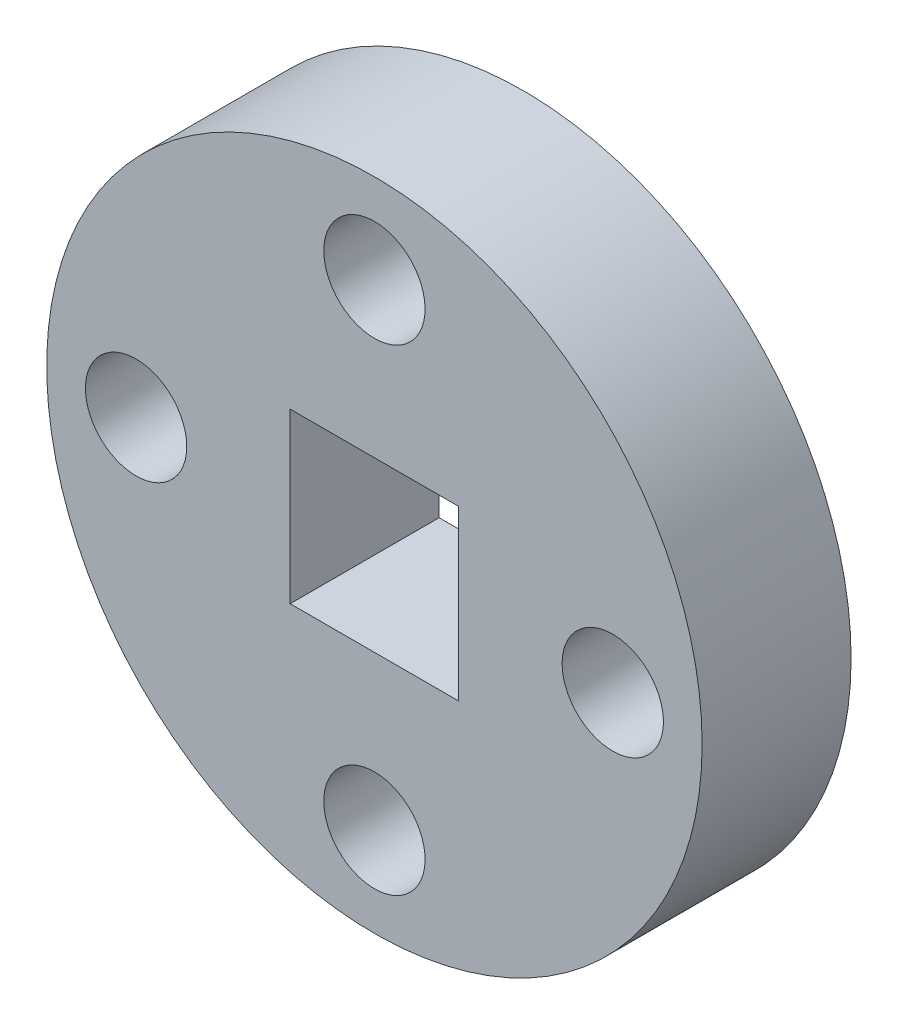
ISO-10303-21;
HEADER;
FILE_DESCRIPTION(('STEP AP214'),'2;1');
FILE_NAME('part.step','',(''),(''),'','','');
FILE_SCHEMA(('AUTOMOTIVE_DESIGN { 1 0 10303 214 1 1 1 1 }'));
ENDSEC;
DATA;
#1=APPLICATION_CONTEXT('core data for automotive mechanical design processes');
#2=APPLICATION_PROTOCOL_DEFINITION('international standard','automotive_design',2000,#1);
#3=PRODUCT_CONTEXT('',#1,'mechanical');
#4=PRODUCT('Part','Part','',(#3));
#5=PRODUCT_RELATED_PRODUCT_CATEGORY('part','',(#4));
#6=PRODUCT_DEFINITION_FORMATION('','',#4);
#7=PRODUCT_DEFINITION_CONTEXT('part definition',#1,'design');
#8=PRODUCT_DEFINITION('design','',#6,#7);
#9=PRODUCT_DEFINITION_SHAPE('','',#8);
#10=(LENGTH_UNIT() NAMED_UNIT(*) SI_UNIT(.MILLI.,.METRE.));
#11=(NAMED_UNIT(*) PLANE_ANGLE_UNIT() SI_UNIT($,.RADIAN.));
#12=(NAMED_UNIT(*) SI_UNIT($,.STERADIAN.) SOLID_ANGLE_UNIT());
#13=UNCERTAINTY_MEASURE_WITH_UNIT(LENGTH_MEASURE(1.E-05),#10,'distance_accuracy_value','');
#14=(GEOMETRIC_REPRESENTATION_CONTEXT(3) GLOBAL_UNCERTAINTY_ASSIGNED_CONTEXT((#13)) GLOBAL_UNIT_ASSIGNED_CONTEXT((#10,
#11,#12)) REPRESENTATION_CONTEXT('',''));
#15=CARTESIAN_POINT('',(0.,0.,0.));
#16=DIRECTION('',(0.,0.,1.));
#17=DIRECTION('',(1.,0.,0.));
#18=AXIS2_PLACEMENT_3D('',#15,#16,#17);
#19=CARTESIAN_POINT('',(8.,0.,5.));
#20=DIRECTION('',(0.,0.,1.));
#21=DIRECTION('',(1.,0.,0.));
#22=AXIS2_PLACEMENT_3D('',#19,#20,#21);
#23=CYLINDRICAL_SURFACE('',#22,0.999999999999999);
#24=CARTESIAN_POINT('',(8.,0.,0.));
#25=DIRECTION('',(0.,0.,1.));
#26=DIRECTION('',(1.,0.,0.));
#27=AXIS2_PLACEMENT_3D('',#24,#25,#26);
#28=CIRCLE('',#27,0.999999999999999);
#29=CARTESIAN_POINT('',(9.,0.,0.));
#30=VERTEX_POINT('',#29);
#31=EDGE_CURVE('E116',#30,#30,#28,.T.);
#32=ORIENTED_EDGE('',*,*,#31,.F.);
#33=EDGE_LOOP('',(#32));
#34=FACE_BOUND('',#33,.T.);
#35=CARTESIAN_POINT('',(8.,0.,2.5));
#36=DIRECTION('',(0.,0.,1.));
#37=DIRECTION('',(1.,0.,0.));
#38=AXIS2_PLACEMENT_3D('',#35,#36,#37);
#39=CIRCLE('',#38,0.999999999999999);
#40=CARTESIAN_POINT('',(9.,0.,2.5));
#41=VERTEX_POINT('',#40);
#42=EDGE_CURVE('E49',#41,#41,#39,.F.);
#43=ORIENTED_EDGE('',*,*,#42,.F.);
#44=EDGE_LOOP('',(#43));
#45=FACE_BOUND('',#44,.T.);
#46=ADVANCED_FACE('F45',(#34,#45),#23,.F.);
#47=CARTESIAN_POINT('',(0.,-8.,5.));
#48=DIRECTION('',(0.,0.,1.));
#49=DIRECTION('',(1.,0.,0.));
#50=AXIS2_PLACEMENT_3D('',#47,#48,#49);
#51=CYLINDRICAL_SURFACE('',#50,0.999999999999999);
#52=CARTESIAN_POINT('',(0.,-8.,0.));
#53=DIRECTION('',(0.,0.,1.));
#54=DIRECTION('',(1.,0.,0.));
#55=AXIS2_PLACEMENT_3D('',#52,#53,#54);
#56=CIRCLE('',#55,0.999999999999999);
#57=CARTESIAN_POINT('',(0.999999999999999,-8.,0.));
#58=VERTEX_POINT('',#57);
#59=EDGE_CURVE('E157',#58,#58,#56,.T.);
#60=ORIENTED_EDGE('',*,*,#59,.F.);
#61=EDGE_LOOP('',(#60));
#62=FACE_BOUND('',#61,.T.);
#63=CARTESIAN_POINT('',(0.,-8.,2.5));
#64=DIRECTION('',(0.,0.,1.));
#65=DIRECTION('',(1.,0.,0.));
#66=AXIS2_PLACEMENT_3D('',#63,#64,#65);
#67=CIRCLE('',#66,0.999999999999999);
#68=CARTESIAN_POINT('',(0.999999999999999,-8.,2.5));
#69=VERTEX_POINT('',#68);
#70=EDGE_CURVE('E135',#69,#69,#67,.F.);
#71=ORIENTED_EDGE('',*,*,#70,.F.);
#72=EDGE_LOOP('',(#71));
#73=FACE_BOUND('',#72,.T.);
#74=ADVANCED_FACE('F167',(#62,#73),#51,.F.);
#75=CARTESIAN_POINT('',(0.,8.,5.));
#76=DIRECTION('',(0.,0.,1.));
#77=DIRECTION('',(1.,0.,0.));
#78=AXIS2_PLACEMENT_3D('',#75,#76,#77);
#79=CYLINDRICAL_SURFACE('',#78,0.999999999999999);
#80=CARTESIAN_POINT('',(0.,8.,0.));
#81=DIRECTION('',(0.,0.,1.));
#82=DIRECTION('',(1.,0.,0.));
#83=AXIS2_PLACEMENT_3D('',#80,#81,#82);
#84=CIRCLE('',#83,0.999999999999999);
#85=CARTESIAN_POINT('',(0.999999999999999,8.,0.));
#86=VERTEX_POINT('',#85);
#87=EDGE_CURVE('E131',#86,#86,#84,.T.);
#88=ORIENTED_EDGE('',*,*,#87,.F.);
#89=EDGE_LOOP('',(#88));
#90=FACE_BOUND('',#89,.T.);
#91=CARTESIAN_POINT('',(0.,8.,2.5));
#92=DIRECTION('',(0.,0.,1.));
#93=DIRECTION('',(1.,0.,0.));
#94=AXIS2_PLACEMENT_3D('',#91,#92,#93);
#95=CIRCLE('',#94,0.999999999999999);
#96=CARTESIAN_POINT('',(0.999999999999999,8.,2.5));
#97=VERTEX_POINT('',#96);
#98=EDGE_CURVE('E133',#97,#97,#95,.F.);
#99=ORIENTED_EDGE('',*,*,#98,.F.);
#100=EDGE_LOOP('',(#99));
#101=FACE_BOUND('',#100,.T.);
#102=ADVANCED_FACE('F173',(#90,#101),#79,.F.);
#103=CARTESIAN_POINT('',(-8.,0.,5.));
#104=DIRECTION('',(0.,0.,1.));
#105=DIRECTION('',(1.,0.,0.));
#106=AXIS2_PLACEMENT_3D('',#103,#104,#105);
#107=CYLINDRICAL_SURFACE('',#106,0.999999999999999);
#108=CARTESIAN_POINT('',(-8.,0.,0.));
#109=DIRECTION('',(0.,0.,1.));
#110=DIRECTION('',(1.,0.,0.));
#111=AXIS2_PLACEMENT_3D('',#108,#109,#110);
#112=CIRCLE('',#111,0.999999999999999);
#113=CARTESIAN_POINT('',(-7.,0.,0.));
#114=VERTEX_POINT('',#113);
#115=EDGE_CURVE('E154',#114,#114,#112,.T.);
#116=ORIENTED_EDGE('',*,*,#115,.F.);
#117=EDGE_LOOP('',(#116));
#118=FACE_BOUND('',#117,.T.);
#119=CARTESIAN_POINT('',(-8.,0.,2.5));
#120=DIRECTION('',(0.,0.,1.));
#121=DIRECTION('',(1.,0.,0.));
#122=AXIS2_PLACEMENT_3D('',#119,#120,#121);
#123=CIRCLE('',#122,0.999999999999999);
#124=CARTESIAN_POINT('',(-7.,0.,2.5));
#125=VERTEX_POINT('',#124);
#126=EDGE_CURVE('E128',#125,#125,#123,.F.);
#127=ORIENTED_EDGE('',*,*,#126,.F.);
#128=EDGE_LOOP('',(#127));
#129=FACE_BOUND('',#128,.T.);
#130=ADVANCED_FACE('F191',(#118,#129),#107,.F.);
#131=CARTESIAN_POINT('',(0.,0.,5.));
#132=DIRECTION('',(0.,0.,1.));
#133=DIRECTION('',(1.,0.,0.));
#134=AXIS2_PLACEMENT_3D('',#131,#132,#133);
#135=PLANE('',#134);
#136=CARTESIAN_POINT('',(0.,-8.,5.));
#137=DIRECTION('',(0.,0.,1.));
#138=DIRECTION('',(0.,1.,0.));
#139=AXIS2_PLACEMENT_3D('',#136,#137,#138);
#140=CIRCLE('',#139,1.7);
#141=CARTESIAN_POINT('',(0.,-6.3,5.));
#142=VERTEX_POINT('',#141);
#143=EDGE_CURVE('E257',#142,#142,#140,.T.);
#144=ORIENTED_EDGE('',*,*,#143,.F.);
#145=EDGE_LOOP('',(#144));
#146=FACE_BOUND('',#145,.T.);
#147=CARTESIAN_POINT('',(8.,0.,5.));
#148=DIRECTION('',(0.,0.,1.));
#149=DIRECTION('',(-1.,0.,0.));
#150=AXIS2_PLACEMENT_3D('',#147,#148,#149);
#151=CIRCLE('',#150,1.7);
#152=CARTESIAN_POINT('',(6.3,0.,5.));
#153=VERTEX_POINT('',#152);
#154=EDGE_CURVE('E265',#153,#153,#151,.T.);
#155=ORIENTED_EDGE('',*,*,#154,.F.);
#156=EDGE_LOOP('',(#155));
#157=FACE_BOUND('',#156,.T.);
#158=CARTESIAN_POINT('',(0.,8.,5.));
#159=DIRECTION('',(0.,0.,1.));
#160=DIRECTION('',(0.,-1.,0.));
#161=AXIS2_PLACEMENT_3D('',#158,#159,#160);
#162=CIRCLE('',#161,1.7);
#163=CARTESIAN_POINT('',(0.,6.3,5.));
#164=VERTEX_POINT('',#163);
#165=EDGE_CURVE('E269',#164,#164,#162,.T.);
#166=ORIENTED_EDGE('',*,*,#165,.F.);
#167=EDGE_LOOP('',(#166));
#168=FACE_BOUND('',#167,.T.);
#169=CARTESIAN_POINT('',(-8.,0.,5.));
#170=DIRECTION('',(0.,0.,1.));
#171=DIRECTION('',(1.,0.,0.));
#172=AXIS2_PLACEMENT_3D('',#169,#170,#171);
#173=CIRCLE('',#172,1.7);
#174=CARTESIAN_POINT('',(-6.3,0.,5.));
#175=VERTEX_POINT('',#174);
#176=EDGE_CURVE('E141',#175,#175,#173,.T.);
#177=ORIENTED_EDGE('',*,*,#176,.F.);
#178=EDGE_LOOP('',(#177));
#179=FACE_BOUND('',#178,.T.);
#180=CARTESIAN_POINT('',(0.,0.,5.));
#181=DIRECTION('',(0.,0.,1.));
#182=DIRECTION('',(1.,0.,0.));
#183=AXIS2_PLACEMENT_3D('',#180,#181,#182);
#184=CIRCLE('',#183,11.);
#185=CARTESIAN_POINT('',(11.,0.,5.));
#186=VERTEX_POINT('',#185);
#187=EDGE_CURVE('E11',#186,#186,#184,.T.);
#188=ORIENTED_EDGE('',*,*,#187,.T.);
#189=EDGE_LOOP('',(#188));
#190=FACE_BOUND('',#189,.T.);
#191=DIRECTION('',(0.,1.,0.));
#192=VECTOR('',#191,1.);
#193=CARTESIAN_POINT('',(2.82842712474619,-2.82842712474619,5.));
#194=LINE('',#193,#192);
#195=CARTESIAN_POINT('',(2.82842712474619,-2.82842712474619,5.));
#196=VERTEX_POINT('',#195);
#197=CARTESIAN_POINT('',(2.82842712474619,2.82842712474619,5.));
#198=VERTEX_POINT('',#197);
#199=EDGE_CURVE('E96',#196,#198,#194,.T.);
#200=ORIENTED_EDGE('',*,*,#199,.F.);
#201=DIRECTION('',(1.,0.,0.));
#202=VECTOR('',#201,1.);
#203=CARTESIAN_POINT('',(-2.82842712474619,-2.82842712474619,5.));
#204=LINE('',#203,#202);
#205=CARTESIAN_POINT('',(-2.82842712474619,-2.82842712474619,5.));
#206=VERTEX_POINT('',#205);
#207=EDGE_CURVE('E88',#206,#196,#204,.T.);
#208=ORIENTED_EDGE('',*,*,#207,.F.);
#209=DIRECTION('',(0.,-1.,0.));
#210=VECTOR('',#209,1.);
#211=CARTESIAN_POINT('',(-2.82842712474619,-2.82842712474619,5.));
#212=LINE('',#211,#210);
#213=CARTESIAN_POINT('',(-2.82842712474619,2.82842712474619,5.));
#214=VERTEX_POINT('',#213);
#215=EDGE_CURVE('E110',#214,#206,#212,.T.);
#216=ORIENTED_EDGE('',*,*,#215,.F.);
#217=DIRECTION('',(-1.,0.,0.));
#218=VECTOR('',#217,1.);
#219=CARTESIAN_POINT('',(-2.82842712474619,2.82842712474619,5.));
#220=LINE('',#219,#218);
#221=EDGE_CURVE('E108',#198,#214,#220,.T.);
#222=ORIENTED_EDGE('',*,*,#221,.F.);
#223=EDGE_LOOP('',(#200,#208,#216,#222));
#224=FACE_BOUND('',#223,.T.);
#225=ADVANCED_FACE('F107',(#146,#157,#168,#179,#190,#224),#135,.T.);
#226=CARTESIAN_POINT('',(0.,0.,0.));
#227=DIRECTION('',(0.,0.,1.));
#228=DIRECTION('',(1.,0.,0.));
#229=AXIS2_PLACEMENT_3D('',#226,#227,#228);
#230=PLANE('',#229);
#231=ORIENTED_EDGE('',*,*,#87,.T.);
#232=EDGE_LOOP('',(#231));
#233=FACE_BOUND('',#232,.T.);
#234=ORIENTED_EDGE('',*,*,#115,.T.);
#235=EDGE_LOOP('',(#234));
#236=FACE_BOUND('',#235,.T.);
#237=ORIENTED_EDGE('',*,*,#59,.T.);
#238=EDGE_LOOP('',(#237));
#239=FACE_BOUND('',#238,.T.);
#240=ORIENTED_EDGE('',*,*,#31,.T.);
#241=EDGE_LOOP('',(#240));
#242=FACE_BOUND('',#241,.T.);
#243=CARTESIAN_POINT('',(0.,0.,0.));
#244=DIRECTION('',(0.,0.,1.));
#245=DIRECTION('',(1.,0.,0.));
#246=AXIS2_PLACEMENT_3D('',#243,#244,#245);
#247=CIRCLE('',#246,11.);
#248=CARTESIAN_POINT('',(11.,0.,0.));
#249=VERTEX_POINT('',#248);
#250=EDGE_CURVE('E54',#249,#249,#247,.T.);
#251=ORIENTED_EDGE('',*,*,#250,.F.);
#252=EDGE_LOOP('',(#251));
#253=FACE_BOUND('',#252,.T.);
#254=DIRECTION('',(1.,0.,0.));
#255=VECTOR('',#254,1.);
#256=CARTESIAN_POINT('',(-2.82842712474619,-2.82842712474619,0.));
#257=LINE('',#256,#255);
#258=CARTESIAN_POINT('',(-2.82842712474619,-2.82842712474619,0.));
#259=VERTEX_POINT('',#258);
#260=CARTESIAN_POINT('',(2.82842712474619,-2.82842712474619,0.));
#261=VERTEX_POINT('',#260);
#262=EDGE_CURVE('E70',#259,#261,#257,.T.);
#263=ORIENTED_EDGE('',*,*,#262,.T.);
#264=DIRECTION('',(0.,1.,0.));
#265=VECTOR('',#264,1.);
#266=CARTESIAN_POINT('',(2.82842712474619,-2.82842712474619,0.));
#267=LINE('',#266,#265);
#268=CARTESIAN_POINT('',(2.82842712474619,2.82842712474619,0.));
#269=VERTEX_POINT('',#268);
#270=EDGE_CURVE('E103',#261,#269,#267,.T.);
#271=ORIENTED_EDGE('',*,*,#270,.T.);
#272=DIRECTION('',(-1.,0.,0.));
#273=VECTOR('',#272,1.);
#274=CARTESIAN_POINT('',(-2.82842712474619,2.82842712474619,0.));
#275=LINE('',#274,#273);
#276=CARTESIAN_POINT('',(-2.82842712474619,2.82842712474619,0.));
#277=VERTEX_POINT('',#276);
#278=EDGE_CURVE('E118',#269,#277,#275,.T.);
#279=ORIENTED_EDGE('',*,*,#278,.T.);
#280=DIRECTION('',(0.,-1.,0.));
#281=VECTOR('',#280,1.);
#282=CARTESIAN_POINT('',(-2.82842712474619,-2.82842712474619,0.));
#283=LINE('',#282,#281);
#284=EDGE_CURVE('E97',#277,#259,#283,.T.);
#285=ORIENTED_EDGE('',*,*,#284,.T.);
#286=EDGE_LOOP('',(#263,#271,#279,#285));
#287=FACE_BOUND('',#286,.T.);
#288=ADVANCED_FACE('F162',(#233,#236,#239,#242,#253,#287),#230,.F.);
#289=CARTESIAN_POINT('',(0.,0.,5.));
#290=DIRECTION('',(0.,0.,-1.));
#291=DIRECTION('',(-1.,0.,0.));
#292=AXIS2_PLACEMENT_3D('',#289,#290,#291);
#293=CYLINDRICAL_SURFACE('',#292,11.);
#294=ORIENTED_EDGE('',*,*,#187,.F.);
#295=EDGE_LOOP('',(#294));
#296=FACE_BOUND('',#295,.T.);
#297=ORIENTED_EDGE('',*,*,#250,.T.);
#298=EDGE_LOOP('',(#297));
#299=FACE_BOUND('',#298,.T.);
#300=ADVANCED_FACE('F47',(#296,#299),#293,.T.);
#301=CARTESIAN_POINT('',(-2.82842712474619,-2.82842712474619,5.));
#302=DIRECTION('',(0.,1.,0.));
#303=DIRECTION('',(0.,0.,1.));
#304=AXIS2_PLACEMENT_3D('',#301,#302,#303);
#305=PLANE('',#304);
#306=ORIENTED_EDGE('',*,*,#262,.F.);
#307=DIRECTION('',(0.,0.,-1.));
#308=VECTOR('',#307,1.);
#309=CARTESIAN_POINT('',(-2.82842712474619,-2.82842712474619,5.));
#310=LINE('',#309,#308);
#311=EDGE_CURVE('E92',#206,#259,#310,.T.);
#312=ORIENTED_EDGE('',*,*,#311,.F.);
#313=ORIENTED_EDGE('',*,*,#207,.T.);
#314=DIRECTION('',(0.,0.,-1.));
#315=VECTOR('',#314,1.);
#316=CARTESIAN_POINT('',(2.82842712474619,-2.82842712474619,5.));
#317=LINE('',#316,#315);
#318=EDGE_CURVE('E91',#196,#261,#317,.T.);
#319=ORIENTED_EDGE('',*,*,#318,.T.);
#320=EDGE_LOOP('',(#306,#312,#313,#319));
#321=FACE_BOUND('',#320,.T.);
#322=ADVANCED_FACE('F90',(#321),#305,.T.);
#323=CARTESIAN_POINT('',(2.82842712474619,-2.82842712474619,5.));
#324=DIRECTION('',(-1.,0.,0.));
#325=DIRECTION('',(0.,0.,1.));
#326=AXIS2_PLACEMENT_3D('',#323,#324,#325);
#327=PLANE('',#326);
#328=ORIENTED_EDGE('',*,*,#270,.F.);
#329=ORIENTED_EDGE('',*,*,#318,.F.);
#330=ORIENTED_EDGE('',*,*,#199,.T.);
#331=DIRECTION('',(0.,0.,-1.));
#332=VECTOR('',#331,1.);
#333=CARTESIAN_POINT('',(2.82842712474619,2.82842712474619,5.));
#334=LINE('',#333,#332);
#335=EDGE_CURVE('E104',#198,#269,#334,.T.);
#336=ORIENTED_EDGE('',*,*,#335,.T.);
#337=EDGE_LOOP('',(#328,#329,#330,#336));
#338=FACE_BOUND('',#337,.T.);
#339=ADVANCED_FACE('F100',(#338),#327,.T.);
#340=CARTESIAN_POINT('',(-2.82842712474619,2.82842712474619,5.));
#341=DIRECTION('',(0.,-1.,0.));
#342=DIRECTION('',(0.,0.,-1.));
#343=AXIS2_PLACEMENT_3D('',#340,#341,#342);
#344=PLANE('',#343);
#345=ORIENTED_EDGE('',*,*,#278,.F.);
#346=ORIENTED_EDGE('',*,*,#335,.F.);
#347=ORIENTED_EDGE('',*,*,#221,.T.);
#348=DIRECTION('',(0.,0.,-1.));
#349=VECTOR('',#348,1.);
#350=CARTESIAN_POINT('',(-2.82842712474619,2.82842712474619,5.));
#351=LINE('',#350,#349);
#352=EDGE_CURVE('E62',#214,#277,#351,.T.);
#353=ORIENTED_EDGE('',*,*,#352,.T.);
#354=EDGE_LOOP('',(#345,#346,#347,#353));
#355=FACE_BOUND('',#354,.T.);
#356=ADVANCED_FACE('F182',(#355),#344,.T.);
#357=CARTESIAN_POINT('',(-2.82842712474619,-2.82842712474619,5.));
#358=DIRECTION('',(1.,0.,0.));
#359=DIRECTION('',(0.,0.,-1.));
#360=AXIS2_PLACEMENT_3D('',#357,#358,#359);
#361=PLANE('',#360);
#362=ORIENTED_EDGE('',*,*,#284,.F.);
#363=ORIENTED_EDGE('',*,*,#352,.F.);
#364=ORIENTED_EDGE('',*,*,#215,.T.);
#365=ORIENTED_EDGE('',*,*,#311,.T.);
#366=EDGE_LOOP('',(#362,#363,#364,#365));
#367=FACE_BOUND('',#366,.T.);
#368=ADVANCED_FACE('F178',(#367),#361,.T.);
#369=CARTESIAN_POINT('',(-8.,0.,2.5));
#370=DIRECTION('',(0.,0.,1.));
#371=DIRECTION('',(1.,0.,0.));
#372=AXIS2_PLACEMENT_3D('',#369,#370,#371);
#373=PLANE('',#372);
#374=CARTESIAN_POINT('',(-8.,0.,2.5));
#375=DIRECTION('',(0.,0.,1.));
#376=DIRECTION('',(1.,0.,0.));
#377=AXIS2_PLACEMENT_3D('',#374,#375,#376);
#378=CIRCLE('',#377,1.7);
#379=CARTESIAN_POINT('',(-6.3,0.,2.5));
#380=VERTEX_POINT('',#379);
#381=EDGE_CURVE('E132',#380,#380,#378,.T.);
#382=ORIENTED_EDGE('',*,*,#381,.T.);
#383=EDGE_LOOP('',(#382));
#384=FACE_BOUND('',#383,.T.);
#385=ORIENTED_EDGE('',*,*,#126,.T.);
#386=EDGE_LOOP('',(#385));
#387=FACE_BOUND('',#386,.T.);
#388=ADVANCED_FACE('F181',(#384,#387),#373,.T.);
#389=CARTESIAN_POINT('',(-8.,0.,2.5));
#390=DIRECTION('',(0.,0.,1.));
#391=DIRECTION('',(1.,0.,0.));
#392=AXIS2_PLACEMENT_3D('',#389,#390,#391);
#393=CYLINDRICAL_SURFACE('',#392,1.7);
#394=ORIENTED_EDGE('',*,*,#381,.F.);
#395=EDGE_LOOP('',(#394));
#396=FACE_BOUND('',#395,.T.);
#397=ORIENTED_EDGE('',*,*,#176,.T.);
#398=EDGE_LOOP('',(#397));
#399=FACE_BOUND('',#398,.T.);
#400=ADVANCED_FACE('F211',(#396,#399),#393,.F.);
#401=CARTESIAN_POINT('',(0.,8.,2.5));
#402=DIRECTION('',(0.,0.,1.));
#403=DIRECTION('',(0.,-1.,0.));
#404=AXIS2_PLACEMENT_3D('',#401,#402,#403);
#405=PLANE('',#404);
#406=CARTESIAN_POINT('',(0.,8.,2.5));
#407=DIRECTION('',(0.,0.,1.));
#408=DIRECTION('',(0.,-1.,0.));
#409=AXIS2_PLACEMENT_3D('',#406,#407,#408);
#410=CIRCLE('',#409,1.7);
#411=CARTESIAN_POINT('',(0.,6.3,2.5));
#412=VERTEX_POINT('',#411);
#413=EDGE_CURVE('E268',#412,#412,#410,.T.);
#414=ORIENTED_EDGE('',*,*,#413,.T.);
#415=EDGE_LOOP('',(#414));
#416=FACE_BOUND('',#415,.T.);
#417=ORIENTED_EDGE('',*,*,#98,.T.);
#418=EDGE_LOOP('',(#417));
#419=FACE_BOUND('',#418,.T.);
#420=ADVANCED_FACE('F216',(#416,#419),#405,.T.);
#421=CARTESIAN_POINT('',(0.,8.,2.5));
#422=DIRECTION('',(0.,0.,1.));
#423=DIRECTION('',(1.,0.,0.));
#424=AXIS2_PLACEMENT_3D('',#421,#422,#423);
#425=CYLINDRICAL_SURFACE('',#424,1.7);
#426=ORIENTED_EDGE('',*,*,#413,.F.);
#427=EDGE_LOOP('',(#426));
#428=FACE_BOUND('',#427,.T.);
#429=ORIENTED_EDGE('',*,*,#165,.T.);
#430=EDGE_LOOP('',(#429));
#431=FACE_BOUND('',#430,.T.);
#432=ADVANCED_FACE('F220',(#428,#431),#425,.F.);
#433=CARTESIAN_POINT('',(0.,-8.,2.5));
#434=DIRECTION('',(0.,0.,1.));
#435=DIRECTION('',(0.,1.,0.));
#436=AXIS2_PLACEMENT_3D('',#433,#434,#435);
#437=PLANE('',#436);
#438=CARTESIAN_POINT('',(0.,-8.,2.5));
#439=DIRECTION('',(0.,0.,1.));
#440=DIRECTION('',(0.,1.,0.));
#441=AXIS2_PLACEMENT_3D('',#438,#439,#440);
#442=CIRCLE('',#441,1.7);
#443=CARTESIAN_POINT('',(0.,-6.3,2.5));
#444=VERTEX_POINT('',#443);
#445=EDGE_CURVE('E136',#444,#444,#442,.T.);
#446=ORIENTED_EDGE('',*,*,#445,.T.);
#447=EDGE_LOOP('',(#446));
#448=FACE_BOUND('',#447,.T.);
#449=ORIENTED_EDGE('',*,*,#70,.T.);
#450=EDGE_LOOP('',(#449));
#451=FACE_BOUND('',#450,.T.);
#452=ADVANCED_FACE('F235',(#448,#451),#437,.T.);
#453=CARTESIAN_POINT('',(0.,-8.,2.5));
#454=DIRECTION('',(0.,0.,1.));
#455=DIRECTION('',(1.,0.,0.));
#456=AXIS2_PLACEMENT_3D('',#453,#454,#455);
#457=CYLINDRICAL_SURFACE('',#456,1.7);
#458=ORIENTED_EDGE('',*,*,#445,.F.);
#459=EDGE_LOOP('',(#458));
#460=FACE_BOUND('',#459,.T.);
#461=ORIENTED_EDGE('',*,*,#143,.T.);
#462=EDGE_LOOP('',(#461));
#463=FACE_BOUND('',#462,.T.);
#464=ADVANCED_FACE('F246',(#460,#463),#457,.F.);
#465=CARTESIAN_POINT('',(8.,0.,2.5));
#466=DIRECTION('',(0.,0.,1.));
#467=DIRECTION('',(-1.,0.,0.));
#468=AXIS2_PLACEMENT_3D('',#465,#466,#467);
#469=PLANE('',#468);
#470=CARTESIAN_POINT('',(8.,0.,2.5));
#471=DIRECTION('',(0.,0.,1.));
#472=DIRECTION('',(-1.,0.,0.));
#473=AXIS2_PLACEMENT_3D('',#470,#471,#472);
#474=CIRCLE('',#473,1.7);
#475=CARTESIAN_POINT('',(6.3,0.,2.5));
#476=VERTEX_POINT('',#475);
#477=EDGE_CURVE('E260',#476,#476,#474,.T.);
#478=ORIENTED_EDGE('',*,*,#477,.T.);
#479=EDGE_LOOP('',(#478));
#480=FACE_BOUND('',#479,.T.);
#481=ORIENTED_EDGE('',*,*,#42,.T.);
#482=EDGE_LOOP('',(#481));
#483=FACE_BOUND('',#482,.T.);
#484=ADVANCED_FACE('F242',(#480,#483),#469,.T.);
#485=CARTESIAN_POINT('',(8.,0.,2.5));
#486=DIRECTION('',(0.,0.,1.));
#487=DIRECTION('',(1.,0.,0.));
#488=AXIS2_PLACEMENT_3D('',#485,#486,#487);
#489=CYLINDRICAL_SURFACE('',#488,1.7);
#490=ORIENTED_EDGE('',*,*,#477,.F.);
#491=EDGE_LOOP('',(#490));
#492=FACE_BOUND('',#491,.T.);
#493=ORIENTED_EDGE('',*,*,#154,.T.);
#494=EDGE_LOOP('',(#493));
#495=FACE_BOUND('',#494,.T.);
#496=ADVANCED_FACE('F239',(#492,#495),#489,.F.);
#497=CLOSED_SHELL('',(#46,#74,#102,#130,#225,#288,#300,#322,#339,#356,#368,#388,#400,#420,#432,
#452,#464,#484,#496));
#498=MANIFOLD_SOLID_BREP('B2',#497);
#499=ADVANCED_BREP_SHAPE_REPRESENTATION('',(#18,#498),#14);
#500=SHAPE_DEFINITION_REPRESENTATION(#9,#499);
ENDSEC;
END-ISO-10303-21;
